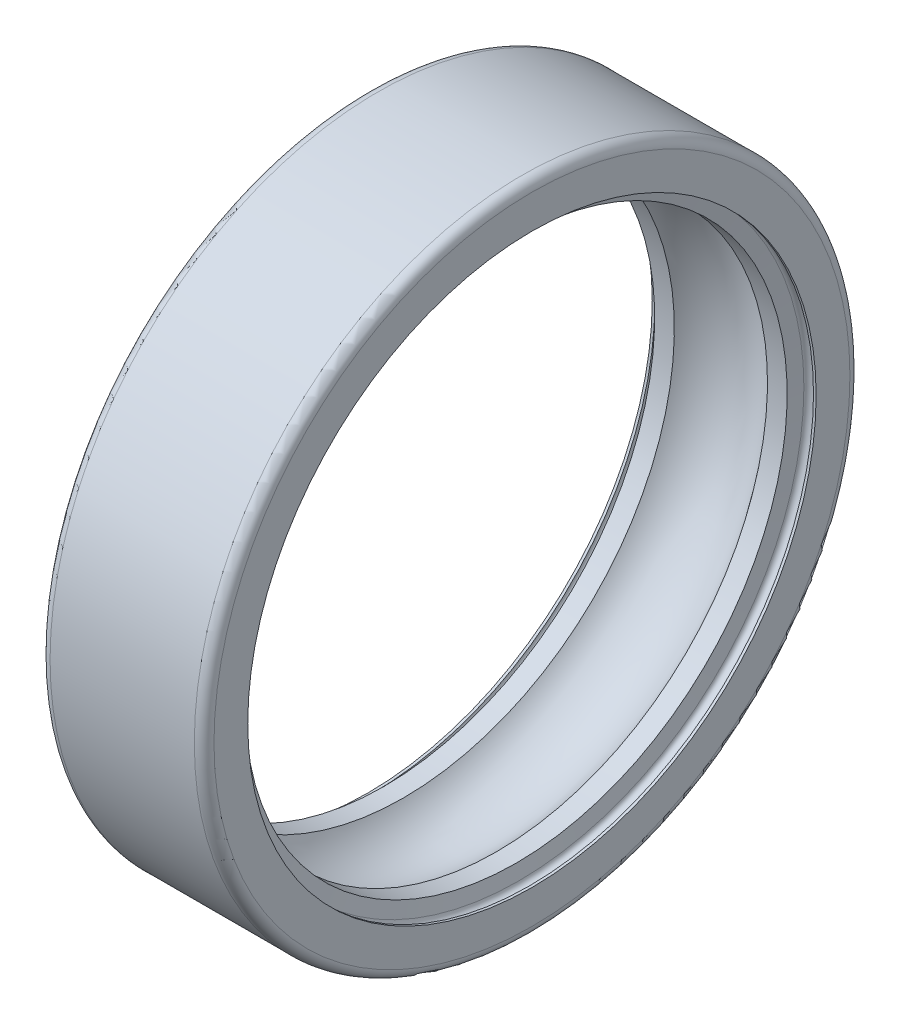
ISO-10303-21;
HEADER;
FILE_DESCRIPTION(('STEP AP214'),'2;1');
FILE_NAME('part.step','',(''),(''),'','','');
FILE_SCHEMA(('AUTOMOTIVE_DESIGN { 1 0 10303 214 1 1 1 1 }'));
ENDSEC;
DATA;
#1=APPLICATION_CONTEXT('core data for automotive mechanical design processes');
#2=APPLICATION_PROTOCOL_DEFINITION('international standard','automotive_design',2000,#1);
#3=PRODUCT_CONTEXT('',#1,'mechanical');
#4=PRODUCT('Part','Part','',(#3));
#5=PRODUCT_RELATED_PRODUCT_CATEGORY('part','',(#4));
#6=PRODUCT_DEFINITION_FORMATION('','',#4);
#7=PRODUCT_DEFINITION_CONTEXT('part definition',#1,'design');
#8=PRODUCT_DEFINITION('design','',#6,#7);
#9=PRODUCT_DEFINITION_SHAPE('','',#8);
#10=(LENGTH_UNIT() NAMED_UNIT(*) SI_UNIT(.MILLI.,.METRE.));
#11=(NAMED_UNIT(*) PLANE_ANGLE_UNIT() SI_UNIT($,.RADIAN.));
#12=(NAMED_UNIT(*) SI_UNIT($,.STERADIAN.) SOLID_ANGLE_UNIT());
#13=UNCERTAINTY_MEASURE_WITH_UNIT(LENGTH_MEASURE(1.E-05),#10,'distance_accuracy_value','');
#14=(GEOMETRIC_REPRESENTATION_CONTEXT(3) GLOBAL_UNCERTAINTY_ASSIGNED_CONTEXT((#13)) GLOBAL_UNIT_ASSIGNED_CONTEXT((#10,
#11,#12)) REPRESENTATION_CONTEXT('',''));
#15=CARTESIAN_POINT('',(0.,0.,0.));
#16=DIRECTION('',(0.,0.,1.));
#17=DIRECTION('',(1.,0.,0.));
#18=AXIS2_PLACEMENT_3D('',#15,#16,#17);
#19=CARTESIAN_POINT('',(23.785,0.,0.));
#20=DIRECTION('',(1.,0.,0.));
#21=DIRECTION('',(0.,0.,-1.));
#22=AXIS2_PLACEMENT_3D('',#19,#20,#21);
#23=TOROIDAL_SURFACE('',#22,43.35,0.81);
#24=CARTESIAN_POINT('',(24.595,0.,0.));
#25=DIRECTION('',(1.,0.,0.));
#26=DIRECTION('',(0.,1.,0.));
#27=AXIS2_PLACEMENT_3D('',#24,#25,#26);
#28=CIRCLE('',#27,43.35);
#29=CARTESIAN_POINT('',(24.595,-43.35,0.));
#30=VERTEX_POINT('',#29);
#31=CARTESIAN_POINT('',(24.595,0.,43.35));
#32=VERTEX_POINT('',#31);
#33=EDGE_CURVE('E28',#30,#32,#28,.T.);
#34=ORIENTED_EDGE('',*,*,#33,.T.);
#35=CARTESIAN_POINT('',(23.785,0.,43.35));
#36=DIRECTION('',(0.,-1.,0.));
#37=DIRECTION('',(0.,0.,1.));
#38=AXIS2_PLACEMENT_3D('',#35,#36,#37);
#39=CIRCLE('',#38,0.81);
#40=CARTESIAN_POINT('',(22.9873057200601,0.,43.4906550239102));
#41=VERTEX_POINT('',#40);
#42=EDGE_CURVE('E11',#32,#41,#39,.T.);
#43=ORIENTED_EDGE('',*,*,#42,.T.);
#44=CARTESIAN_POINT('',(22.9873057200601,0.,0.));
#45=DIRECTION('',(1.,0.,0.));
#46=DIRECTION('',(0.,1.,0.));
#47=AXIS2_PLACEMENT_3D('',#44,#45,#46);
#48=CIRCLE('',#47,43.4906550239102);
#49=CARTESIAN_POINT('',(22.9873057200601,-43.4906550239102,0.));
#50=VERTEX_POINT('',#49);
#51=EDGE_CURVE('E232',#50,#41,#48,.T.);
#52=ORIENTED_EDGE('',*,*,#51,.F.);
#53=CARTESIAN_POINT('',(22.9873057200601,0.,0.));
#54=DIRECTION('',(1.,0.,0.));
#55=DIRECTION('',(0.,1.,0.));
#56=AXIS2_PLACEMENT_3D('',#53,#54,#55);
#57=CIRCLE('',#56,43.4906550239102);
#58=EDGE_CURVE('E228',#41,#50,#57,.T.);
#59=ORIENTED_EDGE('',*,*,#58,.F.);
#60=ORIENTED_EDGE('',*,*,#42,.F.);
#61=CARTESIAN_POINT('',(24.595,0.,0.));
#62=DIRECTION('',(1.,0.,0.));
#63=DIRECTION('',(0.,1.,0.));
#64=AXIS2_PLACEMENT_3D('',#61,#62,#63);
#65=CIRCLE('',#64,43.35);
#66=EDGE_CURVE('E126',#32,#30,#65,.T.);
#67=ORIENTED_EDGE('',*,*,#66,.T.);
#68=EDGE_LOOP('',(#34,#43,#52,#59,#60,#67));
#69=FACE_BOUND('',#68,.T.);
#70=ADVANCED_FACE('F17',(#69),#23,.F.);
#71=CARTESIAN_POINT('',(24.7975,0.,0.));
#72=DIRECTION('',(1.,0.,0.));
#73=DIRECTION('',(0.,1.,0.));
#74=AXIS2_PLACEMENT_3D('',#71,#72,#73);
#75=CYLINDRICAL_SURFACE('',#74,43.35);
#76=CARTESIAN_POINT('',(25.,0.,0.));
#77=DIRECTION('',(1.,0.,0.));
#78=DIRECTION('',(0.,1.,0.));
#79=AXIS2_PLACEMENT_3D('',#76,#77,#78);
#80=CIRCLE('',#79,43.35);
#81=CARTESIAN_POINT('',(25.,-43.35,0.));
#82=VERTEX_POINT('',#81);
#83=EDGE_CURVE('E123',#82,#82,#80,.T.);
#84=ORIENTED_EDGE('',*,*,#83,.T.);
#85=DIRECTION('',(-1.,0.,0.));
#86=VECTOR('',#85,1.);
#87=CARTESIAN_POINT('',(24.7975,-43.35,0.));
#88=LINE('',#87,#86);
#89=EDGE_CURVE('E120',#82,#30,#88,.T.);
#90=ORIENTED_EDGE('',*,*,#89,.T.);
#91=ORIENTED_EDGE('',*,*,#66,.F.);
#92=ORIENTED_EDGE('',*,*,#33,.F.);
#93=ORIENTED_EDGE('',*,*,#89,.F.);
#94=EDGE_LOOP('',(#84,#90,#91,#92,#93));
#95=FACE_BOUND('',#94,.T.);
#96=ADVANCED_FACE('F121',(#95),#75,.F.);
#97=CARTESIAN_POINT('',(25.,45.925,0.));
#98=DIRECTION('',(1.,0.,0.));
#99=DIRECTION('',(0.,1.,0.));
#100=AXIS2_PLACEMENT_3D('',#97,#98,#99);
#101=PLANE('',#100);
#102=ORIENTED_EDGE('',*,*,#83,.F.);
#103=EDGE_LOOP('',(#102));
#104=FACE_BOUND('',#103,.T.);
#105=CARTESIAN_POINT('',(25.,0.,0.));
#106=DIRECTION('',(1.,0.,0.));
#107=DIRECTION('',(0.,1.,0.));
#108=AXIS2_PLACEMENT_3D('',#105,#106,#107);
#109=CIRCLE('',#108,48.5);
#110=CARTESIAN_POINT('',(25.,0.,48.5));
#111=VERTEX_POINT('',#110);
#112=EDGE_CURVE('E199',#111,#111,#109,.T.);
#113=ORIENTED_EDGE('',*,*,#112,.T.);
#114=EDGE_LOOP('',(#113));
#115=FACE_BOUND('',#114,.T.);
#116=ADVANCED_FACE('F460',(#104,#115),#101,.T.);
#117=CARTESIAN_POINT('',(23.5,0.,0.));
#118=DIRECTION('',(1.,0.,0.));
#119=DIRECTION('',(0.,0.,-1.));
#120=AXIS2_PLACEMENT_3D('',#117,#118,#119);
#121=TOROIDAL_SURFACE('',#120,48.5,1.5);
#122=ORIENTED_EDGE('',*,*,#112,.F.);
#123=CARTESIAN_POINT('',(23.5,0.,48.5));
#124=DIRECTION('',(0.,-1.,0.));
#125=DIRECTION('',(0.,0.,1.));
#126=AXIS2_PLACEMENT_3D('',#123,#124,#125);
#127=CIRCLE('',#126,1.5);
#128=CARTESIAN_POINT('',(23.5,0.,50.));
#129=VERTEX_POINT('',#128);
#130=EDGE_CURVE('E134',#111,#129,#127,.T.);
#131=ORIENTED_EDGE('',*,*,#130,.T.);
#132=CARTESIAN_POINT('',(23.5,0.,0.));
#133=DIRECTION('',(1.,0.,0.));
#134=DIRECTION('',(0.,1.,0.));
#135=AXIS2_PLACEMENT_3D('',#132,#133,#134);
#136=CIRCLE('',#135,50.);
#137=CARTESIAN_POINT('',(23.5,-50.,0.));
#138=VERTEX_POINT('',#137);
#139=EDGE_CURVE('E197',#129,#138,#136,.T.);
#140=ORIENTED_EDGE('',*,*,#139,.T.);
#141=CARTESIAN_POINT('',(23.5,0.,0.));
#142=DIRECTION('',(1.,0.,0.));
#143=DIRECTION('',(0.,1.,0.));
#144=AXIS2_PLACEMENT_3D('',#141,#142,#143);
#145=CIRCLE('',#144,50.);
#146=EDGE_CURVE('E163',#138,#129,#145,.T.);
#147=ORIENTED_EDGE('',*,*,#146,.T.);
#148=ORIENTED_EDGE('',*,*,#130,.F.);
#149=EDGE_LOOP('',(#122,#131,#140,#147,#148));
#150=FACE_BOUND('',#149,.T.);
#151=ADVANCED_FACE('F19',(#150),#121,.T.);
#152=CARTESIAN_POINT('',(12.5,0.,0.));
#153=DIRECTION('',(1.,0.,0.));
#154=DIRECTION('',(0.,1.,0.));
#155=AXIS2_PLACEMENT_3D('',#152,#153,#154);
#156=CYLINDRICAL_SURFACE('',#155,50.);
#157=ORIENTED_EDGE('',*,*,#146,.F.);
#158=DIRECTION('',(-1.,0.,0.));
#159=VECTOR('',#158,1.);
#160=CARTESIAN_POINT('',(12.5,-50.,0.));
#161=LINE('',#160,#159);
#162=CARTESIAN_POINT('',(1.5,-50.,0.));
#163=VERTEX_POINT('',#162);
#164=EDGE_CURVE('E173',#138,#163,#161,.T.);
#165=ORIENTED_EDGE('',*,*,#164,.T.);
#166=CARTESIAN_POINT('',(1.5,0.,0.));
#167=DIRECTION('',(1.,0.,0.));
#168=DIRECTION('',(0.,1.,0.));
#169=AXIS2_PLACEMENT_3D('',#166,#167,#168);
#170=CIRCLE('',#169,50.);
#171=CARTESIAN_POINT('',(1.5,0.,50.));
#172=VERTEX_POINT('',#171);
#173=EDGE_CURVE('E176',#163,#172,#170,.T.);
#174=ORIENTED_EDGE('',*,*,#173,.T.);
#175=CARTESIAN_POINT('',(1.5,0.,0.));
#176=DIRECTION('',(1.,0.,0.));
#177=DIRECTION('',(0.,1.,0.));
#178=AXIS2_PLACEMENT_3D('',#175,#176,#177);
#179=CIRCLE('',#178,50.);
#180=EDGE_CURVE('E164',#172,#163,#179,.T.);
#181=ORIENTED_EDGE('',*,*,#180,.T.);
#182=ORIENTED_EDGE('',*,*,#164,.F.);
#183=ORIENTED_EDGE('',*,*,#139,.F.);
#184=EDGE_LOOP('',(#157,#165,#174,#181,#182,#183));
#185=FACE_BOUND('',#184,.T.);
#186=ADVANCED_FACE('F444',(#185),#156,.T.);
#187=CARTESIAN_POINT('',(1.5,0.,0.));
#188=DIRECTION('',(1.,0.,0.));
#189=DIRECTION('',(0.,0.,-1.));
#190=AXIS2_PLACEMENT_3D('',#187,#188,#189);
#191=TOROIDAL_SURFACE('',#190,48.5,1.5);
#192=ORIENTED_EDGE('',*,*,#173,.F.);
#193=ORIENTED_EDGE('',*,*,#180,.F.);
#194=CARTESIAN_POINT('',(1.5,0.,48.5));
#195=DIRECTION('',(0.,-1.,0.));
#196=DIRECTION('',(0.,0.,1.));
#197=AXIS2_PLACEMENT_3D('',#194,#195,#196);
#198=CIRCLE('',#197,1.5);
#199=CARTESIAN_POINT('',(0.,0.,48.5));
#200=VERTEX_POINT('',#199);
#201=EDGE_CURVE('E161',#172,#200,#198,.T.);
#202=ORIENTED_EDGE('',*,*,#201,.T.);
#203=CARTESIAN_POINT('',(0.,0.,0.));
#204=DIRECTION('',(1.,0.,0.));
#205=DIRECTION('',(0.,1.,0.));
#206=AXIS2_PLACEMENT_3D('',#203,#204,#205);
#207=CIRCLE('',#206,48.5);
#208=EDGE_CURVE('E185',#200,#200,#207,.T.);
#209=ORIENTED_EDGE('',*,*,#208,.T.);
#210=ORIENTED_EDGE('',*,*,#201,.F.);
#211=EDGE_LOOP('',(#192,#193,#202,#209,#210));
#212=FACE_BOUND('',#211,.T.);
#213=ADVANCED_FACE('F435',(#212),#191,.T.);
#214=CARTESIAN_POINT('',(0.,45.925,0.));
#215=DIRECTION('',(-1.,0.,0.));
#216=DIRECTION('',(0.,0.,1.));
#217=AXIS2_PLACEMENT_3D('',#214,#215,#216);
#218=PLANE('',#217);
#219=CARTESIAN_POINT('',(0.,0.,0.));
#220=DIRECTION('',(1.,0.,0.));
#221=DIRECTION('',(0.,1.,0.));
#222=AXIS2_PLACEMENT_3D('',#219,#220,#221);
#223=CIRCLE('',#222,43.35);
#224=CARTESIAN_POINT('',(0.,-43.35,0.));
#225=VERTEX_POINT('',#224);
#226=EDGE_CURVE('E200',#225,#225,#223,.T.);
#227=ORIENTED_EDGE('',*,*,#226,.T.);
#228=EDGE_LOOP('',(#227));
#229=FACE_BOUND('',#228,.T.);
#230=ORIENTED_EDGE('',*,*,#208,.F.);
#231=EDGE_LOOP('',(#230));
#232=FACE_BOUND('',#231,.T.);
#233=ADVANCED_FACE('F426',(#229,#232),#218,.T.);
#234=CARTESIAN_POINT('',(0.2025,0.,0.));
#235=DIRECTION('',(1.,0.,0.));
#236=DIRECTION('',(0.,1.,0.));
#237=AXIS2_PLACEMENT_3D('',#234,#235,#236);
#238=CYLINDRICAL_SURFACE('',#237,43.35);
#239=CARTESIAN_POINT('',(0.405,0.,0.));
#240=DIRECTION('',(1.,0.,0.));
#241=DIRECTION('',(0.,1.,0.));
#242=AXIS2_PLACEMENT_3D('',#239,#240,#241);
#243=CIRCLE('',#242,43.35);
#244=CARTESIAN_POINT('',(0.405,-43.35,0.));
#245=VERTEX_POINT('',#244);
#246=CARTESIAN_POINT('',(0.405,0.,43.35));
#247=VERTEX_POINT('',#246);
#248=EDGE_CURVE('E150',#245,#247,#243,.T.);
#249=ORIENTED_EDGE('',*,*,#248,.T.);
#250=CARTESIAN_POINT('',(0.405,0.,0.));
#251=DIRECTION('',(1.,0.,0.));
#252=DIRECTION('',(0.,1.,0.));
#253=AXIS2_PLACEMENT_3D('',#250,#251,#252);
#254=CIRCLE('',#253,43.35);
#255=EDGE_CURVE('E154',#247,#245,#254,.T.);
#256=ORIENTED_EDGE('',*,*,#255,.T.);
#257=DIRECTION('',(-1.,0.,0.));
#258=VECTOR('',#257,1.);
#259=CARTESIAN_POINT('',(0.2025,-43.35,0.));
#260=LINE('',#259,#258);
#261=EDGE_CURVE('E196',#245,#225,#260,.T.);
#262=ORIENTED_EDGE('',*,*,#261,.T.);
#263=ORIENTED_EDGE('',*,*,#226,.F.);
#264=ORIENTED_EDGE('',*,*,#261,.F.);
#265=EDGE_LOOP('',(#249,#256,#262,#263,#264));
#266=FACE_BOUND('',#265,.T.);
#267=ADVANCED_FACE('F418',(#266),#238,.F.);
#268=CARTESIAN_POINT('',(1.215,0.,0.));
#269=DIRECTION('',(1.,0.,0.));
#270=DIRECTION('',(0.,0.,-1.));
#271=AXIS2_PLACEMENT_3D('',#268,#269,#270);
#272=TOROIDAL_SURFACE('',#271,43.35,0.81);
#273=CARTESIAN_POINT('',(2.01269427993989,0.,0.));
#274=DIRECTION('',(1.,0.,0.));
#275=DIRECTION('',(0.,1.,0.));
#276=AXIS2_PLACEMENT_3D('',#273,#274,#275);
#277=CIRCLE('',#276,43.4906550239102);
#278=CARTESIAN_POINT('',(2.01269427993989,-43.4906550239102,0.));
#279=VERTEX_POINT('',#278);
#280=CARTESIAN_POINT('',(2.01269427993989,0.,43.4906550239102));
#281=VERTEX_POINT('',#280);
#282=EDGE_CURVE('E138',#279,#281,#277,.T.);
#283=ORIENTED_EDGE('',*,*,#282,.T.);
#284=CARTESIAN_POINT('',(1.215,0.,43.35));
#285=DIRECTION('',(0.,-1.,0.));
#286=DIRECTION('',(0.,0.,1.));
#287=AXIS2_PLACEMENT_3D('',#284,#285,#286);
#288=CIRCLE('',#287,0.81);
#289=EDGE_CURVE('E155',#281,#247,#288,.T.);
#290=ORIENTED_EDGE('',*,*,#289,.T.);
#291=ORIENTED_EDGE('',*,*,#248,.F.);
#292=ORIENTED_EDGE('',*,*,#255,.F.);
#293=ORIENTED_EDGE('',*,*,#289,.F.);
#294=CARTESIAN_POINT('',(2.01269427993989,0.,0.));
#295=DIRECTION('',(1.,0.,0.));
#296=DIRECTION('',(0.,1.,0.));
#297=AXIS2_PLACEMENT_3D('',#294,#295,#296);
#298=CIRCLE('',#297,43.4906550239102);
#299=EDGE_CURVE('E222',#281,#279,#298,.T.);
#300=ORIENTED_EDGE('',*,*,#299,.T.);
#301=EDGE_LOOP('',(#283,#290,#291,#292,#293,#300));
#302=FACE_BOUND('',#301,.T.);
#303=ADVANCED_FACE('F262',(#302),#272,.F.);
#304=CARTESIAN_POINT('',(2.20362598575099,0.,0.));
#305=DIRECTION('',(-1.,0.,0.));
#306=DIRECTION('',(0.,1.,0.));
#307=AXIS2_PLACEMENT_3D('',#304,#305,#306);
#308=CONICAL_SURFACE('',#307,42.4078275119551,1.39626340159546);
#309=CARTESIAN_POINT('',(2.3945576915621,0.,0.));
#310=DIRECTION('',(1.,0.,0.));
#311=DIRECTION('',(0.,1.,0.));
#312=AXIS2_PLACEMENT_3D('',#309,#310,#311);
#313=CIRCLE('',#312,41.325);
#314=CARTESIAN_POINT('',(2.3945576915621,-41.325,0.));
#315=VERTEX_POINT('',#314);
#316=EDGE_CURVE('E144',#315,#315,#313,.T.);
#317=ORIENTED_EDGE('',*,*,#316,.T.);
#318=DIRECTION('',(-0.173648177666932,-0.984807753012208,0.));
#319=VECTOR('',#318,1.);
#320=CARTESIAN_POINT('',(2.20362598575099,-42.4078275119551,0.));
#321=LINE('',#320,#319);
#322=EDGE_CURVE('E218',#315,#279,#321,.T.);
#323=ORIENTED_EDGE('',*,*,#322,.T.);
#324=ORIENTED_EDGE('',*,*,#299,.F.);
#325=ORIENTED_EDGE('',*,*,#282,.F.);
#326=ORIENTED_EDGE('',*,*,#322,.F.);
#327=EDGE_LOOP('',(#317,#323,#324,#325,#326));
#328=FACE_BOUND('',#327,.T.);
#329=ADVANCED_FACE('F265',(#328),#308,.F.);
#330=CARTESIAN_POINT('',(3.89500014049905,0.,0.));
#331=DIRECTION('',(1.,0.,0.));
#332=DIRECTION('',(0.,1.,0.));
#333=AXIS2_PLACEMENT_3D('',#330,#331,#332);
#334=CYLINDRICAL_SURFACE('',#333,41.325);
#335=CARTESIAN_POINT('',(5.39544258943599,0.,0.));
#336=DIRECTION('',(1.,0.,0.));
#337=DIRECTION('',(0.,1.,0.));
#338=AXIS2_PLACEMENT_3D('',#335,#336,#337);
#339=CIRCLE('',#338,41.325);
#340=CARTESIAN_POINT('',(5.39544258943599,-41.325,0.));
#341=VERTEX_POINT('',#340);
#342=CARTESIAN_POINT('',(5.39544258943599,0.,41.325));
#343=VERTEX_POINT('',#342);
#344=EDGE_CURVE('E146',#341,#343,#339,.T.);
#345=ORIENTED_EDGE('',*,*,#344,.T.);
#346=CARTESIAN_POINT('',(5.39544258943599,0.,0.));
#347=DIRECTION('',(1.,0.,0.));
#348=DIRECTION('',(0.,1.,0.));
#349=AXIS2_PLACEMENT_3D('',#346,#347,#348);
#350=CIRCLE('',#349,41.325);
#351=EDGE_CURVE('E145',#343,#341,#350,.T.);
#352=ORIENTED_EDGE('',*,*,#351,.T.);
#353=DIRECTION('',(-1.,0.,0.));
#354=VECTOR('',#353,1.);
#355=CARTESIAN_POINT('',(3.89500014049905,-41.325,0.));
#356=LINE('',#355,#354);
#357=EDGE_CURVE('E140',#341,#315,#356,.T.);
#358=ORIENTED_EDGE('',*,*,#357,.T.);
#359=ORIENTED_EDGE('',*,*,#316,.F.);
#360=ORIENTED_EDGE('',*,*,#357,.F.);
#361=EDGE_LOOP('',(#345,#352,#358,#359,#360));
#362=FACE_BOUND('',#361,.T.);
#363=ADVANCED_FACE('F268',(#362),#334,.F.);
#364=CARTESIAN_POINT('',(12.5,0.,0.));
#365=DIRECTION('',(1.,0.,0.));
#366=DIRECTION('',(0.,0.,-1.));
#367=AXIS2_PLACEMENT_3D('',#364,#365,#366);
#368=TOROIDAL_SURFACE('',#367,36.25,8.731);
#369=CARTESIAN_POINT('',(19.604557410564,0.,0.));
#370=DIRECTION('',(1.,0.,0.));
#371=DIRECTION('',(0.,1.,0.));
#372=AXIS2_PLACEMENT_3D('',#369,#370,#371);
#373=CIRCLE('',#372,41.325);
#374=CARTESIAN_POINT('',(19.604557410564,-41.325,0.));
#375=VERTEX_POINT('',#374);
#376=CARTESIAN_POINT('',(19.604557410564,0.,41.325));
#377=VERTEX_POINT('',#376);
#378=EDGE_CURVE('E188',#375,#377,#373,.T.);
#379=ORIENTED_EDGE('',*,*,#378,.T.);
#380=CARTESIAN_POINT('',(12.5,0.,36.25));
#381=DIRECTION('',(0.,-1.,0.));
#382=DIRECTION('',(0.,0.,1.));
#383=AXIS2_PLACEMENT_3D('',#380,#381,#382);
#384=CIRCLE('',#383,8.731);
#385=EDGE_CURVE('E21',#377,#343,#384,.T.);
#386=ORIENTED_EDGE('',*,*,#385,.T.);
#387=ORIENTED_EDGE('',*,*,#344,.F.);
#388=ORIENTED_EDGE('',*,*,#351,.F.);
#389=ORIENTED_EDGE('',*,*,#385,.F.);
#390=CARTESIAN_POINT('',(19.604557410564,0.,0.));
#391=DIRECTION('',(1.,0.,0.));
#392=DIRECTION('',(0.,1.,0.));
#393=AXIS2_PLACEMENT_3D('',#390,#391,#392);
#394=CIRCLE('',#393,41.325);
#395=EDGE_CURVE('E159',#377,#375,#394,.T.);
#396=ORIENTED_EDGE('',*,*,#395,.T.);
#397=EDGE_LOOP('',(#379,#386,#387,#388,#389,#396));
#398=FACE_BOUND('',#397,.T.);
#399=ADVANCED_FACE('F273',(#398),#368,.F.);
#400=CARTESIAN_POINT('',(21.104999859501,0.,0.));
#401=DIRECTION('',(1.,0.,0.));
#402=DIRECTION('',(0.,1.,0.));
#403=AXIS2_PLACEMENT_3D('',#400,#401,#402);
#404=CYLINDRICAL_SURFACE('',#403,41.325);
#405=CARTESIAN_POINT('',(22.6054423084379,0.,0.));
#406=DIRECTION('',(1.,0.,0.));
#407=DIRECTION('',(0.,1.,0.));
#408=AXIS2_PLACEMENT_3D('',#405,#406,#407);
#409=CIRCLE('',#408,41.325);
#410=CARTESIAN_POINT('',(22.6054423084379,-41.325,0.));
#411=VERTEX_POINT('',#410);
#412=EDGE_CURVE('E160',#411,#411,#409,.T.);
#413=ORIENTED_EDGE('',*,*,#412,.T.);
#414=DIRECTION('',(-1.,0.,0.));
#415=VECTOR('',#414,1.);
#416=CARTESIAN_POINT('',(21.104999859501,-41.325,0.));
#417=LINE('',#416,#415);
#418=EDGE_CURVE('E156',#411,#375,#417,.T.);
#419=ORIENTED_EDGE('',*,*,#418,.T.);
#420=ORIENTED_EDGE('',*,*,#395,.F.);
#421=ORIENTED_EDGE('',*,*,#378,.F.);
#422=ORIENTED_EDGE('',*,*,#418,.F.);
#423=EDGE_LOOP('',(#413,#419,#420,#421,#422));
#424=FACE_BOUND('',#423,.T.);
#425=ADVANCED_FACE('F370',(#424),#404,.F.);
#426=CARTESIAN_POINT('',(22.796374014249,0.,0.));
#427=DIRECTION('',(1.,0.,0.));
#428=DIRECTION('',(0.,1.,0.));
#429=AXIS2_PLACEMENT_3D('',#426,#427,#428);
#430=CONICAL_SURFACE('',#429,42.4078275119551,1.39626340159546);
#431=ORIENTED_EDGE('',*,*,#51,.T.);
#432=ORIENTED_EDGE('',*,*,#58,.T.);
#433=DIRECTION('',(-0.173648177666938,0.984807753012207,0.));
#434=VECTOR('',#433,1.);
#435=CARTESIAN_POINT('',(22.796374014249,-42.4078275119551,0.));
#436=LINE('',#435,#434);
#437=EDGE_CURVE('E231',#50,#411,#436,.T.);
#438=ORIENTED_EDGE('',*,*,#437,.T.);
#439=ORIENTED_EDGE('',*,*,#412,.F.);
#440=ORIENTED_EDGE('',*,*,#437,.F.);
#441=EDGE_LOOP('',(#431,#432,#438,#439,#440));
#442=FACE_BOUND('',#441,.T.);
#443=ADVANCED_FACE('F364',(#442),#430,.F.);
#444=CLOSED_SHELL('',(#70,#96,#116,#151,#186,#213,#233,#267,#303,#329,#363,#399,#425,#443));
#445=MANIFOLD_SOLID_BREP('B1',#444);
#446=ADVANCED_BREP_SHAPE_REPRESENTATION('',(#18,#445),#14);
#447=SHAPE_DEFINITION_REPRESENTATION(#9,#446);
ENDSEC;
END-ISO-10303-21;
